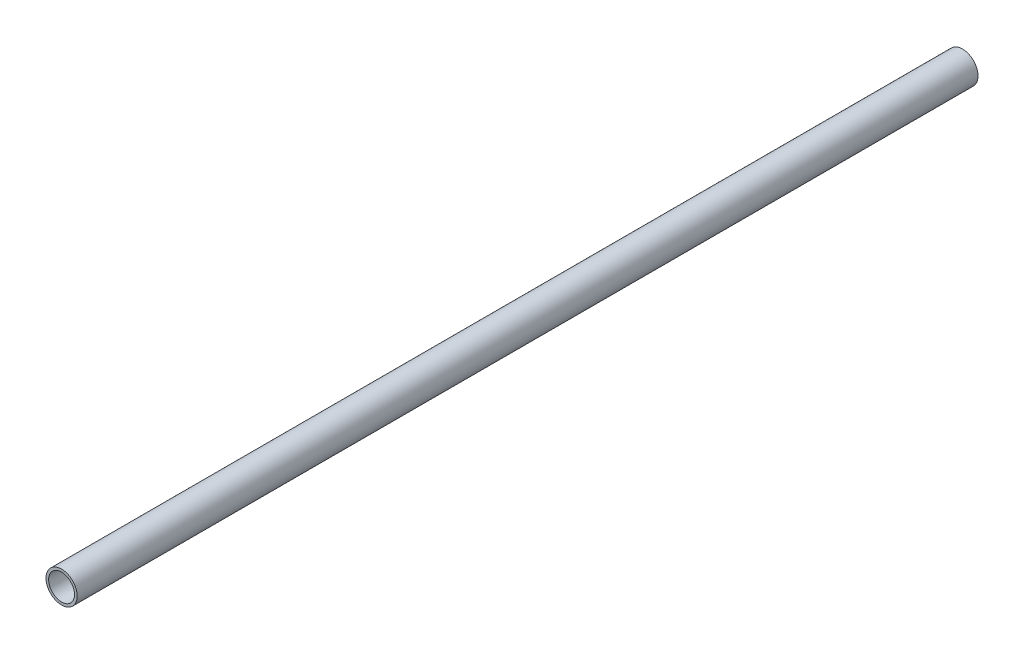
ISO-10303-21;
HEADER;
FILE_DESCRIPTION(('STEP AP214'),'2;1');
FILE_NAME('part.step','',(''),(''),'','','');
FILE_SCHEMA(('AUTOMOTIVE_DESIGN { 1 0 10303 214 1 1 1 1 }'));
ENDSEC;
DATA;
#1=APPLICATION_CONTEXT('core data for automotive mechanical design processes');
#2=APPLICATION_PROTOCOL_DEFINITION('international standard','automotive_design',2000,#1);
#3=PRODUCT_CONTEXT('',#1,'mechanical');
#4=PRODUCT('Part','Part','',(#3));
#5=PRODUCT_RELATED_PRODUCT_CATEGORY('part','',(#4));
#6=PRODUCT_DEFINITION_FORMATION('','',#4);
#7=PRODUCT_DEFINITION_CONTEXT('part definition',#1,'design');
#8=PRODUCT_DEFINITION('design','',#6,#7);
#9=PRODUCT_DEFINITION_SHAPE('','',#8);
#10=(LENGTH_UNIT() NAMED_UNIT(*) SI_UNIT(.MILLI.,.METRE.));
#11=(NAMED_UNIT(*) PLANE_ANGLE_UNIT() SI_UNIT($,.RADIAN.));
#12=(NAMED_UNIT(*) SI_UNIT($,.STERADIAN.) SOLID_ANGLE_UNIT());
#13=UNCERTAINTY_MEASURE_WITH_UNIT(LENGTH_MEASURE(1.E-05),#10,'distance_accuracy_value','');
#14=(GEOMETRIC_REPRESENTATION_CONTEXT(3) GLOBAL_UNCERTAINTY_ASSIGNED_CONTEXT((#13)) GLOBAL_UNIT_ASSIGNED_CONTEXT((#10,
#11,#12)) REPRESENTATION_CONTEXT('',''));
#15=CARTESIAN_POINT('',(0.,0.,0.));
#16=DIRECTION('',(0.,0.,1.));
#17=DIRECTION('',(1.,0.,0.));
#18=AXIS2_PLACEMENT_3D('',#15,#16,#17);
#19=CARTESIAN_POINT('',(0.,0.,1219.2));
#20=DIRECTION('',(0.,0.,1.));
#21=DIRECTION('',(1.,0.,0.));
#22=AXIS2_PLACEMENT_3D('',#19,#20,#21);
#23=PLANE('',#22);
#24=CARTESIAN_POINT('',(0.,0.,1219.2));
#25=DIRECTION('',(0.,0.,1.));
#26=DIRECTION('',(1.,0.,0.));
#27=AXIS2_PLACEMENT_3D('',#24,#25,#26);
#28=CIRCLE('',#27,21.082);
#29=CARTESIAN_POINT('',(-21.082,0.,1219.2));
#30=VERTEX_POINT('',#29);
#31=EDGE_CURVE('E10',#30,#30,#28,.T.);
#32=ORIENTED_EDGE('',*,*,#31,.T.);
#33=EDGE_LOOP('',(#32));
#34=FACE_BOUND('',#33,.T.);
#35=CARTESIAN_POINT('',(0.,0.,1219.2));
#36=DIRECTION('',(0.,0.,1.));
#37=DIRECTION('',(1.,0.,0.));
#38=AXIS2_PLACEMENT_3D('',#35,#36,#37);
#39=CIRCLE('',#38,17.526);
#40=CARTESIAN_POINT('',(-17.526,0.,1219.2));
#41=VERTEX_POINT('',#40);
#42=EDGE_CURVE('E41',#41,#41,#39,.T.);
#43=ORIENTED_EDGE('',*,*,#42,.F.);
#44=EDGE_LOOP('',(#43));
#45=FACE_BOUND('',#44,.T.);
#46=ADVANCED_FACE('F30',(#34,#45),#23,.T.);
#47=CARTESIAN_POINT('',(0.,0.,0.));
#48=DIRECTION('',(0.,0.,1.));
#49=DIRECTION('',(1.,0.,0.));
#50=AXIS2_PLACEMENT_3D('',#47,#48,#49);
#51=PLANE('',#50);
#52=CARTESIAN_POINT('',(0.,0.,0.));
#53=DIRECTION('',(0.,0.,1.));
#54=DIRECTION('',(1.,0.,0.));
#55=AXIS2_PLACEMENT_3D('',#52,#53,#54);
#56=CIRCLE('',#55,21.082);
#57=CARTESIAN_POINT('',(-21.082,0.,0.));
#58=VERTEX_POINT('',#57);
#59=EDGE_CURVE('E34',#58,#58,#56,.T.);
#60=ORIENTED_EDGE('',*,*,#59,.F.);
#61=EDGE_LOOP('',(#60));
#62=FACE_BOUND('',#61,.T.);
#63=CARTESIAN_POINT('',(0.,0.,0.));
#64=DIRECTION('',(0.,0.,1.));
#65=DIRECTION('',(1.,0.,0.));
#66=AXIS2_PLACEMENT_3D('',#63,#64,#65);
#67=CIRCLE('',#66,17.526);
#68=CARTESIAN_POINT('',(-17.526,0.,0.));
#69=VERTEX_POINT('',#68);
#70=EDGE_CURVE('E43',#69,#69,#67,.T.);
#71=ORIENTED_EDGE('',*,*,#70,.T.);
#72=EDGE_LOOP('',(#71));
#73=FACE_BOUND('',#72,.T.);
#74=ADVANCED_FACE('F53',(#62,#73),#51,.F.);
#75=CARTESIAN_POINT('',(0.,0.,1219.2));
#76=DIRECTION('',(0.,0.,-1.));
#77=DIRECTION('',(-1.,0.,0.));
#78=AXIS2_PLACEMENT_3D('',#75,#76,#77);
#79=CYLINDRICAL_SURFACE('',#78,21.082);
#80=CARTESIAN_POINT('',(-21.082,0.,1219.2));
#81=CARTESIAN_POINT('',(-21.082,0.,1206.5));
#82=CARTESIAN_POINT('',(-21.082,0.,1193.8));
#83=CARTESIAN_POINT('',(-21.082,0.,1168.4));
#84=CARTESIAN_POINT('',(-21.082,0.,1155.7));
#85=CARTESIAN_POINT('',(-21.082,0.,1130.3));
#86=CARTESIAN_POINT('',(-21.082,0.,1117.6));
#87=CARTESIAN_POINT('',(-21.082,0.,1092.2));
#88=CARTESIAN_POINT('',(-21.082,0.,1079.5));
#89=CARTESIAN_POINT('',(-21.082,0.,1054.1));
#90=CARTESIAN_POINT('',(-21.082,0.,1041.4));
#91=CARTESIAN_POINT('',(-21.082,0.,1016.));
#92=CARTESIAN_POINT('',(-21.082,0.,1003.3));
#93=CARTESIAN_POINT('',(-21.082,0.,977.9));
#94=CARTESIAN_POINT('',(-21.082,0.,965.2));
#95=CARTESIAN_POINT('',(-21.082,0.,939.8));
#96=CARTESIAN_POINT('',(-21.082,0.,927.1));
#97=CARTESIAN_POINT('',(-21.082,0.,901.7));
#98=CARTESIAN_POINT('',(-21.082,0.,889.));
#99=CARTESIAN_POINT('',(-21.082,0.,863.6));
#100=CARTESIAN_POINT('',(-21.082,0.,850.9));
#101=CARTESIAN_POINT('',(-21.082,0.,825.5));
#102=CARTESIAN_POINT('',(-21.082,0.,812.8));
#103=CARTESIAN_POINT('',(-21.082,0.,787.4));
#104=CARTESIAN_POINT('',(-21.082,0.,774.7));
#105=CARTESIAN_POINT('',(-21.082,0.,749.3));
#106=CARTESIAN_POINT('',(-21.082,0.,736.6));
#107=CARTESIAN_POINT('',(-21.082,0.,711.2));
#108=CARTESIAN_POINT('',(-21.082,0.,698.5));
#109=CARTESIAN_POINT('',(-21.082,0.,673.1));
#110=CARTESIAN_POINT('',(-21.082,0.,660.4));
#111=CARTESIAN_POINT('',(-21.082,0.,635.));
#112=CARTESIAN_POINT('',(-21.082,0.,622.3));
#113=CARTESIAN_POINT('',(-21.082,0.,596.9));
#114=CARTESIAN_POINT('',(-21.082,0.,584.2));
#115=CARTESIAN_POINT('',(-21.082,0.,558.8));
#116=CARTESIAN_POINT('',(-21.082,0.,546.1));
#117=CARTESIAN_POINT('',(-21.082,0.,520.7));
#118=CARTESIAN_POINT('',(-21.082,0.,508.));
#119=CARTESIAN_POINT('',(-21.082,0.,482.6));
#120=CARTESIAN_POINT('',(-21.082,0.,469.9));
#121=CARTESIAN_POINT('',(-21.082,0.,444.5));
#122=CARTESIAN_POINT('',(-21.082,0.,431.8));
#123=CARTESIAN_POINT('',(-21.082,0.,406.4));
#124=CARTESIAN_POINT('',(-21.082,0.,393.7));
#125=CARTESIAN_POINT('',(-21.082,0.,368.3));
#126=CARTESIAN_POINT('',(-21.082,0.,355.6));
#127=CARTESIAN_POINT('',(-21.082,0.,330.2));
#128=CARTESIAN_POINT('',(-21.082,0.,317.5));
#129=CARTESIAN_POINT('',(-21.082,0.,292.1));
#130=CARTESIAN_POINT('',(-21.082,0.,279.4));
#131=CARTESIAN_POINT('',(-21.082,0.,254.));
#132=CARTESIAN_POINT('',(-21.082,0.,241.3));
#133=CARTESIAN_POINT('',(-21.082,0.,215.9));
#134=CARTESIAN_POINT('',(-21.082,0.,203.2));
#135=CARTESIAN_POINT('',(-21.082,0.,177.8));
#136=CARTESIAN_POINT('',(-21.082,0.,165.1));
#137=CARTESIAN_POINT('',(-21.082,0.,139.7));
#138=CARTESIAN_POINT('',(-21.082,0.,127.));
#139=CARTESIAN_POINT('',(-21.082,0.,101.6));
#140=CARTESIAN_POINT('',(-21.082,0.,88.9));
#141=CARTESIAN_POINT('',(-21.082,0.,63.5));
#142=CARTESIAN_POINT('',(-21.082,0.,50.8));
#143=CARTESIAN_POINT('',(-21.082,0.,25.4));
#144=CARTESIAN_POINT('',(-21.082,0.,12.7));
#145=CARTESIAN_POINT('',(-21.082,0.,0.));
#146=B_SPLINE_CURVE_WITH_KNOTS('',3,(#80,#81,#82,#83,#84,#85,#86,#87,#88,#89,#90,#91,#92,#93,
#94,#95,#96,#97,#98,#99,#100,#101,#102,#103,#104,#105,#106,#107,#108,#109,#110,#111,#112,#113,
#114,#115,#116,#117,#118,#119,#120,#121,#122,#123,#124,#125,#126,#127,#128,#129,#130,#131,#132,
#133,#134,#135,#136,#137,#138,#139,#140,#141,#142,#143,#144,#145),.UNSPECIFIED.,.F.,.F.,(4,2,2,
2,2,2,2,2,2,2,2,2,2,2,2,2,2,2,2,2,2,2,2,2,2,2,2,2,2,2,2,2,4),(0.,38.1,76.2,114.3,152.4,190.5,
228.6,266.7,304.8,342.9,381.,419.1,457.2,495.3,533.4,571.5,609.6,647.7,685.8,723.9,762.,800.1,
838.2,876.3,914.4,952.5,990.6,1028.7,1066.8,1104.9,1143.,1181.1,1219.2),.UNSPECIFIED.);
#147=EDGE_CURVE('BSEAM32',#30,#58,#146,.T.);
#148=ORIENTED_EDGE('',*,*,#31,.F.);
#149=ORIENTED_EDGE('',*,*,#59,.T.);
#150=ORIENTED_EDGE('',*,*,#147,.T.);
#151=ORIENTED_EDGE('',*,*,#147,.F.);
#152=EDGE_LOOP('',(#148,#150,#149,#151));
#153=FACE_BOUND('',#152,.T.);
#154=ADVANCED_FACE('F32',(#153),#79,.T.);
#155=CARTESIAN_POINT('',(0.,0.,1219.2));
#156=DIRECTION('',(0.,0.,-1.));
#157=DIRECTION('',(-1.,0.,0.));
#158=AXIS2_PLACEMENT_3D('',#155,#156,#157);
#159=CYLINDRICAL_SURFACE('',#158,17.526);
#160=CARTESIAN_POINT('',(-17.526,0.,1219.2));
#161=CARTESIAN_POINT('',(-17.526,0.,1206.5));
#162=CARTESIAN_POINT('',(-17.526,0.,1193.8));
#163=CARTESIAN_POINT('',(-17.526,0.,1168.4));
#164=CARTESIAN_POINT('',(-17.526,0.,1155.7));
#165=CARTESIAN_POINT('',(-17.526,0.,1130.3));
#166=CARTESIAN_POINT('',(-17.526,0.,1117.6));
#167=CARTESIAN_POINT('',(-17.526,0.,1092.2));
#168=CARTESIAN_POINT('',(-17.526,0.,1079.5));
#169=CARTESIAN_POINT('',(-17.526,0.,1054.1));
#170=CARTESIAN_POINT('',(-17.526,0.,1041.4));
#171=CARTESIAN_POINT('',(-17.526,0.,1016.));
#172=CARTESIAN_POINT('',(-17.526,0.,1003.3));
#173=CARTESIAN_POINT('',(-17.526,0.,977.9));
#174=CARTESIAN_POINT('',(-17.526,0.,965.2));
#175=CARTESIAN_POINT('',(-17.526,0.,939.8));
#176=CARTESIAN_POINT('',(-17.526,0.,927.1));
#177=CARTESIAN_POINT('',(-17.526,0.,901.7));
#178=CARTESIAN_POINT('',(-17.526,0.,889.));
#179=CARTESIAN_POINT('',(-17.526,0.,863.6));
#180=CARTESIAN_POINT('',(-17.526,0.,850.9));
#181=CARTESIAN_POINT('',(-17.526,0.,825.5));
#182=CARTESIAN_POINT('',(-17.526,0.,812.8));
#183=CARTESIAN_POINT('',(-17.526,0.,787.4));
#184=CARTESIAN_POINT('',(-17.526,0.,774.7));
#185=CARTESIAN_POINT('',(-17.526,0.,749.3));
#186=CARTESIAN_POINT('',(-17.526,0.,736.6));
#187=CARTESIAN_POINT('',(-17.526,0.,711.2));
#188=CARTESIAN_POINT('',(-17.526,0.,698.5));
#189=CARTESIAN_POINT('',(-17.526,0.,673.1));
#190=CARTESIAN_POINT('',(-17.526,0.,660.4));
#191=CARTESIAN_POINT('',(-17.526,0.,635.));
#192=CARTESIAN_POINT('',(-17.526,0.,622.3));
#193=CARTESIAN_POINT('',(-17.526,0.,596.9));
#194=CARTESIAN_POINT('',(-17.526,0.,584.2));
#195=CARTESIAN_POINT('',(-17.526,0.,558.8));
#196=CARTESIAN_POINT('',(-17.526,0.,546.1));
#197=CARTESIAN_POINT('',(-17.526,0.,520.7));
#198=CARTESIAN_POINT('',(-17.526,0.,508.));
#199=CARTESIAN_POINT('',(-17.526,0.,482.6));
#200=CARTESIAN_POINT('',(-17.526,0.,469.9));
#201=CARTESIAN_POINT('',(-17.526,0.,444.5));
#202=CARTESIAN_POINT('',(-17.526,0.,431.8));
#203=CARTESIAN_POINT('',(-17.526,0.,406.4));
#204=CARTESIAN_POINT('',(-17.526,0.,393.7));
#205=CARTESIAN_POINT('',(-17.526,0.,368.3));
#206=CARTESIAN_POINT('',(-17.526,0.,355.6));
#207=CARTESIAN_POINT('',(-17.526,0.,330.2));
#208=CARTESIAN_POINT('',(-17.526,0.,317.5));
#209=CARTESIAN_POINT('',(-17.526,0.,292.1));
#210=CARTESIAN_POINT('',(-17.526,0.,279.4));
#211=CARTESIAN_POINT('',(-17.526,0.,254.));
#212=CARTESIAN_POINT('',(-17.526,0.,241.3));
#213=CARTESIAN_POINT('',(-17.526,0.,215.9));
#214=CARTESIAN_POINT('',(-17.526,0.,203.2));
#215=CARTESIAN_POINT('',(-17.526,0.,177.8));
#216=CARTESIAN_POINT('',(-17.526,0.,165.1));
#217=CARTESIAN_POINT('',(-17.526,0.,139.7));
#218=CARTESIAN_POINT('',(-17.526,0.,127.));
#219=CARTESIAN_POINT('',(-17.526,0.,101.6));
#220=CARTESIAN_POINT('',(-17.526,0.,88.9));
#221=CARTESIAN_POINT('',(-17.526,0.,63.5));
#222=CARTESIAN_POINT('',(-17.526,0.,50.8));
#223=CARTESIAN_POINT('',(-17.526,0.,25.4));
#224=CARTESIAN_POINT('',(-17.526,0.,12.7));
#225=CARTESIAN_POINT('',(-17.526,0.,0.));
#226=B_SPLINE_CURVE_WITH_KNOTS('',3,(#160,#161,#162,#163,#164,#165,#166,#167,#168,#169,#170,
#171,#172,#173,#174,#175,#176,#177,#178,#179,#180,#181,#182,#183,#184,#185,#186,#187,#188,#189,
#190,#191,#192,#193,#194,#195,#196,#197,#198,#199,#200,#201,#202,#203,#204,#205,#206,#207,#208,
#209,#210,#211,#212,#213,#214,#215,#216,#217,#218,#219,#220,#221,#222,#223,#224,#225),
.UNSPECIFIED.,.F.,.F.,(4,2,2,2,2,2,2,2,2,2,2,2,2,2,2,2,2,2,2,2,2,2,2,2,2,2,2,2,2,2,2,2,4),(0.,
38.1,76.2,114.3,152.4,190.5,228.6,266.7,304.8,342.9,381.,419.1,457.2,495.3,533.4,571.5,609.6,
647.7,685.8,723.9,762.,800.1,838.2,876.3,914.4,952.5,990.6,1028.7,1066.8,1104.9,1143.,1181.1,
1219.2),.UNSPECIFIED.);
#227=EDGE_CURVE('BSEAM49',#41,#69,#226,.T.);
#228=ORIENTED_EDGE('',*,*,#42,.T.);
#229=ORIENTED_EDGE('',*,*,#70,.F.);
#230=ORIENTED_EDGE('',*,*,#227,.T.);
#231=ORIENTED_EDGE('',*,*,#227,.F.);
#232=EDGE_LOOP('',(#228,#230,#229,#231));
#233=FACE_BOUND('',#232,.T.);
#234=ADVANCED_FACE('F49',(#233),#159,.F.);
#235=CLOSED_SHELL('',(#46,#74,#154,#234));
#236=MANIFOLD_SOLID_BREP('B2',#235);
#237=ADVANCED_BREP_SHAPE_REPRESENTATION('',(#18,#236),#14);
#238=SHAPE_DEFINITION_REPRESENTATION(#9,#237);
ENDSEC;
END-ISO-10303-21;
